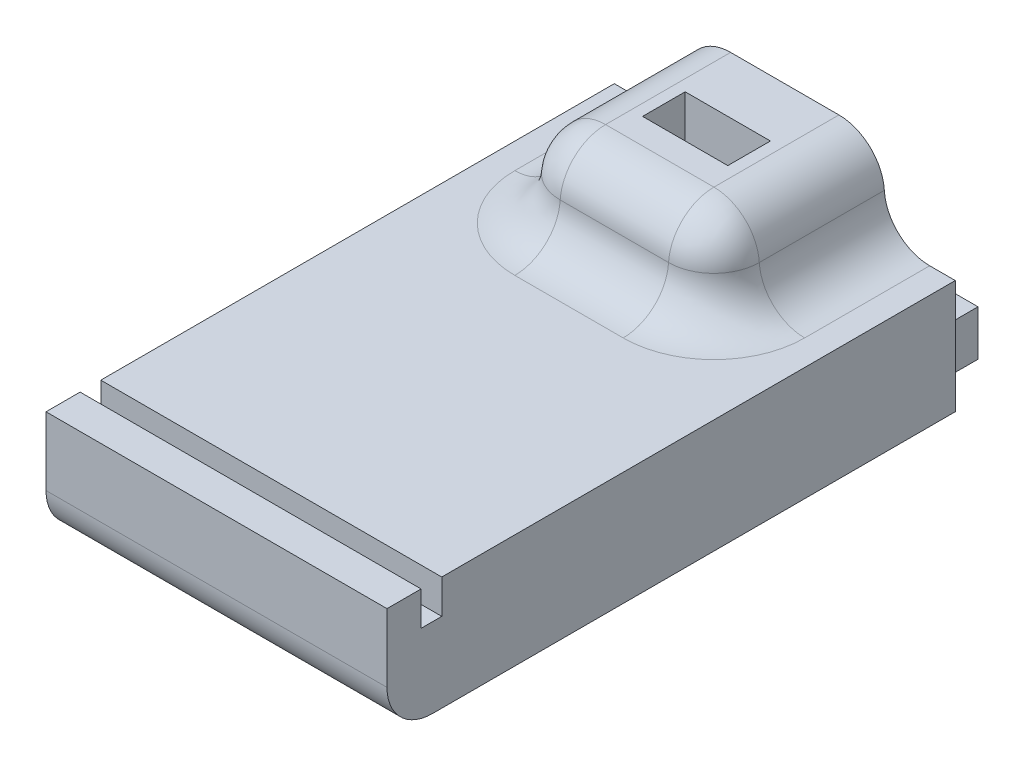
ISO-10303-21;
HEADER;
FILE_DESCRIPTION(('STEP AP214'),'2;1');
FILE_NAME('part.step','',(''),(''),'','','');
FILE_SCHEMA(('AUTOMOTIVE_DESIGN { 1 0 10303 214 1 1 1 1 }'));
ENDSEC;
DATA;
#1=APPLICATION_CONTEXT('core data for automotive mechanical design processes');
#2=APPLICATION_PROTOCOL_DEFINITION('international standard','automotive_design',2000,#1);
#3=PRODUCT_CONTEXT('',#1,'mechanical');
#4=PRODUCT('Part','Part','',(#3));
#5=PRODUCT_RELATED_PRODUCT_CATEGORY('part','',(#4));
#6=PRODUCT_DEFINITION_FORMATION('','',#4);
#7=PRODUCT_DEFINITION_CONTEXT('part definition',#1,'design');
#8=PRODUCT_DEFINITION('design','',#6,#7);
#9=PRODUCT_DEFINITION_SHAPE('','',#8);
#10=(LENGTH_UNIT() NAMED_UNIT(*) SI_UNIT(.MILLI.,.METRE.));
#11=(NAMED_UNIT(*) PLANE_ANGLE_UNIT() SI_UNIT($,.RADIAN.));
#12=(NAMED_UNIT(*) SI_UNIT($,.STERADIAN.) SOLID_ANGLE_UNIT());
#13=UNCERTAINTY_MEASURE_WITH_UNIT(LENGTH_MEASURE(1.E-05),#10,'distance_accuracy_value','');
#14=(GEOMETRIC_REPRESENTATION_CONTEXT(3) GLOBAL_UNCERTAINTY_ASSIGNED_CONTEXT((#13)) GLOBAL_UNIT_ASSIGNED_CONTEXT((#10,
#11,#12)) REPRESENTATION_CONTEXT('',''));
#15=CARTESIAN_POINT('',(0.,0.,0.));
#16=DIRECTION('',(0.,0.,1.));
#17=DIRECTION('',(1.,0.,0.));
#18=AXIS2_PLACEMENT_3D('',#15,#16,#17);
#19=CARTESIAN_POINT('',(0.,10.,0.));
#20=DIRECTION('',(0.,1.,0.));
#21=DIRECTION('',(0.,0.,1.));
#22=AXIS2_PLACEMENT_3D('',#19,#20,#21);
#23=PLANE('',#22);
#24=DIRECTION('',(-1.,0.,0.));
#25=VECTOR('',#24,1.);
#26=CARTESIAN_POINT('',(-15.,10.,20.18));
#27=LINE('',#26,#25);
#28=CARTESIAN_POINT('',(15.,10.,20.18));
#29=VERTEX_POINT('',#28);
#30=CARTESIAN_POINT('',(-15.,10.,20.18));
#31=VERTEX_POINT('',#30);
#32=EDGE_CURVE('E259',#29,#31,#27,.T.);
#33=ORIENTED_EDGE('',*,*,#32,.F.);
#34=DIRECTION('',(0.,0.,-1.));
#35=VECTOR('',#34,1.);
#36=CARTESIAN_POINT('',(15.,10.,-25.));
#37=LINE('',#36,#35);
#38=CARTESIAN_POINT('',(15.,10.,-25.));
#39=VERTEX_POINT('',#38);
#40=EDGE_CURVE('E431',#29,#39,#37,.T.);
#41=ORIENTED_EDGE('',*,*,#40,.T.);
#42=DIRECTION('',(-1.,0.,0.));
#43=VECTOR('',#42,1.);
#44=CARTESIAN_POINT('',(-15.,10.,-25.));
#45=LINE('',#44,#43);
#46=CARTESIAN_POINT('',(12.75,10.,-25.));
#47=VERTEX_POINT('',#46);
#48=EDGE_CURVE('E432',#39,#47,#45,.T.);
#49=ORIENTED_EDGE('',*,*,#48,.T.);
#50=DIRECTION('',(0.,0.,-1.));
#51=VECTOR('',#50,1.);
#52=CARTESIAN_POINT('',(12.75,10.,-10.));
#53=LINE('',#52,#51);
#54=CARTESIAN_POINT('',(12.75,10.,-14.));
#55=VERTEX_POINT('',#54);
#56=EDGE_CURVE('E481',#47,#55,#53,.F.);
#57=ORIENTED_EDGE('',*,*,#56,.T.);
#58=CARTESIAN_POINT('',(4.76564028866434,10.,-14.));
#59=DIRECTION('',(0.,1.,0.));
#60=DIRECTION('',(0.,0.,1.));
#61=AXIS2_PLACEMENT_3D('',#58,#59,#60);
#62=CIRCLE('',#61,7.98435971133566);
#63=CARTESIAN_POINT('',(4.76564028866434,10.,-6.01564028866435));
#64=VERTEX_POINT('',#63);
#65=EDGE_CURVE('E535',#55,#64,#62,.F.);
#66=ORIENTED_EDGE('',*,*,#65,.T.);
#67=DIRECTION('',(-1.,0.,0.));
#68=VECTOR('',#67,1.);
#69=CARTESIAN_POINT('',(-5.82179676972449,10.,-6.01564028866435));
#70=LINE('',#69,#68);
#71=CARTESIAN_POINT('',(-4.76564028866434,10.,-6.01564028866435));
#72=VERTEX_POINT('',#71);
#73=EDGE_CURVE('E524',#64,#72,#70,.T.);
#74=ORIENTED_EDGE('',*,*,#73,.T.);
#75=CARTESIAN_POINT('',(-4.76564028866434,10.,-14.));
#76=DIRECTION('',(0.,1.,0.));
#77=DIRECTION('',(0.,0.,1.));
#78=AXIS2_PLACEMENT_3D('',#75,#76,#77);
#79=CIRCLE('',#78,7.98435971133566);
#80=CARTESIAN_POINT('',(-12.75,10.,-14.));
#81=VERTEX_POINT('',#80);
#82=EDGE_CURVE('E538',#72,#81,#79,.F.);
#83=ORIENTED_EDGE('',*,*,#82,.T.);
#84=DIRECTION('',(0.,0.,1.));
#85=VECTOR('',#84,1.);
#86=CARTESIAN_POINT('',(-12.75,10.,-25.));
#87=LINE('',#86,#85);
#88=CARTESIAN_POINT('',(-12.75,10.,-25.));
#89=VERTEX_POINT('',#88);
#90=EDGE_CURVE('E478',#81,#89,#87,.F.);
#91=ORIENTED_EDGE('',*,*,#90,.T.);
#92=CARTESIAN_POINT('',(-15.,10.,-25.));
#93=VERTEX_POINT('',#92);
#94=EDGE_CURVE('E430',#89,#93,#45,.T.);
#95=ORIENTED_EDGE('',*,*,#94,.T.);
#96=DIRECTION('',(0.,0.,1.));
#97=VECTOR('',#96,1.);
#98=CARTESIAN_POINT('',(-15.,10.,-25.));
#99=LINE('',#98,#97);
#100=EDGE_CURVE('E436',#93,#31,#99,.T.);
#101=ORIENTED_EDGE('',*,*,#100,.T.);
#102=EDGE_LOOP('',(#33,#41,#49,#57,#66,#74,#83,#91,#95,#101));
#103=FACE_BOUND('',#102,.T.);
#104=ADVANCED_FACE('F41',(#103),#23,.T.);
#105=CARTESIAN_POINT('',(8.75,17.5,-10.));
#106=DIRECTION('',(0.,1.,0.));
#107=DIRECTION('',(0.,0.,1.));
#108=AXIS2_PLACEMENT_3D('',#105,#106,#107);
#109=PLANE('',#108);
#110=DIRECTION('',(1.,0.,0.));
#111=VECTOR('',#110,1.);
#112=CARTESIAN_POINT('',(8.75,17.5,-14.));
#113=LINE('',#112,#111);
#114=CARTESIAN_POINT('',(-4.76564028866434,17.5,-14.));
#115=VERTEX_POINT('',#114);
#116=CARTESIAN_POINT('',(4.76564028866434,17.5,-14.));
#117=VERTEX_POINT('',#116);
#118=EDGE_CURVE('E468',#115,#117,#113,.T.);
#119=ORIENTED_EDGE('',*,*,#118,.T.);
#120=DIRECTION('',(0.,0.,-1.));
#121=VECTOR('',#120,1.);
#122=CARTESIAN_POINT('',(4.76564028866434,17.5,-25.));
#123=LINE('',#122,#121);
#124=CARTESIAN_POINT('',(4.76564028866434,17.5,-25.));
#125=VERTEX_POINT('',#124);
#126=EDGE_CURVE('E515',#117,#125,#123,.T.);
#127=ORIENTED_EDGE('',*,*,#126,.T.);
#128=DIRECTION('',(1.,0.,0.));
#129=VECTOR('',#128,1.);
#130=CARTESIAN_POINT('',(8.75,17.5,-25.));
#131=LINE('',#130,#129);
#132=CARTESIAN_POINT('',(-4.76564028866434,17.5,-25.));
#133=VERTEX_POINT('',#132);
#134=EDGE_CURVE('E336',#133,#125,#131,.T.);
#135=ORIENTED_EDGE('',*,*,#134,.F.);
#136=DIRECTION('',(0.,0.,1.));
#137=VECTOR('',#136,1.);
#138=CARTESIAN_POINT('',(-4.76564028866434,17.5,-14.));
#139=LINE('',#138,#137);
#140=EDGE_CURVE('E512',#133,#115,#139,.T.);
#141=ORIENTED_EDGE('',*,*,#140,.T.);
#142=EDGE_LOOP('',(#119,#127,#135,#141));
#143=FACE_BOUND('',#142,.T.);
#144=DIRECTION('',(0.,0.,-1.));
#145=VECTOR('',#144,1.);
#146=CARTESIAN_POINT('',(3.73708770393565,17.5,-16.25));
#147=LINE('',#146,#145);
#148=CARTESIAN_POINT('',(3.73708770393565,17.5,-16.25));
#149=VERTEX_POINT('',#148);
#150=CARTESIAN_POINT('',(3.73708770393565,17.5,-20.));
#151=VERTEX_POINT('',#150);
#152=EDGE_CURVE('E319',#149,#151,#147,.T.);
#153=ORIENTED_EDGE('',*,*,#152,.F.);
#154=DIRECTION('',(1.,0.,0.));
#155=VECTOR('',#154,1.);
#156=CARTESIAN_POINT('',(3.73708770393565,17.5,-16.25));
#157=LINE('',#156,#155);
#158=CARTESIAN_POINT('',(-3.76292046746812,17.5,-16.25));
#159=VERTEX_POINT('',#158);
#160=EDGE_CURVE('E287',#159,#149,#157,.T.);
#161=ORIENTED_EDGE('',*,*,#160,.F.);
#162=DIRECTION('',(0.,0.,-1.));
#163=VECTOR('',#162,1.);
#164=CARTESIAN_POINT('',(-3.76292046746812,17.5,-16.25));
#165=LINE('',#164,#163);
#166=CARTESIAN_POINT('',(-3.76292046746812,17.5,-20.));
#167=VERTEX_POINT('',#166);
#168=EDGE_CURVE('E323',#159,#167,#165,.T.);
#169=ORIENTED_EDGE('',*,*,#168,.T.);
#170=DIRECTION('',(1.,0.,0.));
#171=VECTOR('',#170,1.);
#172=CARTESIAN_POINT('',(3.73708770393565,17.5,-20.));
#173=LINE('',#172,#171);
#174=EDGE_CURVE('E308',#167,#151,#173,.T.);
#175=ORIENTED_EDGE('',*,*,#174,.T.);
#176=EDGE_LOOP('',(#153,#161,#169,#175));
#177=FACE_BOUND('',#176,.T.);
#178=ADVANCED_FACE('F634',(#143,#177),#109,.T.);
#179=CARTESIAN_POINT('',(-15.,10.,-25.));
#180=DIRECTION('',(0.,0.,1.));
#181=DIRECTION('',(1.,0.,0.));
#182=AXIS2_PLACEMENT_3D('',#179,#180,#181);
#183=PLANE('',#182);
#184=CARTESIAN_POINT('',(0.,8.75,-25.));
#185=DIRECTION('',(0.,0.,-1.));
#186=DIRECTION('',(-1.,0.,0.));
#187=AXIS2_PLACEMENT_3D('',#184,#185,#186);
#188=CIRCLE('',#187,2.5);
#189=CARTESIAN_POINT('',(-2.5,8.75,-25.));
#190=VERTEX_POINT('',#189);
#191=EDGE_CURVE('E337',#190,#190,#188,.T.);
#192=ORIENTED_EDGE('',*,*,#191,.F.);
#193=EDGE_LOOP('',(#192));
#194=FACE_BOUND('',#193,.T.);
#195=ORIENTED_EDGE('',*,*,#134,.T.);
#196=CARTESIAN_POINT('',(4.76564028866434,13.5,-25.));
#197=DIRECTION('',(0.,0.,1.));
#198=DIRECTION('',(1.,0.,0.));
#199=AXIS2_PLACEMENT_3D('',#196,#197,#198);
#200=CIRCLE('',#199,4.);
#201=CARTESIAN_POINT('',(8.75782014433217,13.75,-25.));
#202=VERTEX_POINT('',#201);
#203=EDGE_CURVE('E521',#125,#202,#200,.F.);
#204=ORIENTED_EDGE('',*,*,#203,.T.);
#205=CARTESIAN_POINT('',(12.75,14.,-25.));
#206=DIRECTION('',(0.,0.,1.));
#207=DIRECTION('',(1.,0.,0.));
#208=AXIS2_PLACEMENT_3D('',#205,#206,#207);
#209=CIRCLE('',#208,4.);
#210=EDGE_CURVE('E485',#202,#47,#209,.T.);
#211=ORIENTED_EDGE('',*,*,#210,.T.);
#212=ORIENTED_EDGE('',*,*,#48,.F.);
#213=DIRECTION('',(0.,-1.,0.));
#214=VECTOR('',#213,1.);
#215=CARTESIAN_POINT('',(15.,10.,-25.));
#216=LINE('',#215,#214);
#217=CARTESIAN_POINT('',(15.,0.,-25.));
#218=VERTEX_POINT('',#217);
#219=EDGE_CURVE('E464',#39,#218,#216,.T.);
#220=ORIENTED_EDGE('',*,*,#219,.T.);
#221=DIRECTION('',(-1.,0.,0.));
#222=VECTOR('',#221,1.);
#223=CARTESIAN_POINT('',(-15.,0.,-25.));
#224=LINE('',#223,#222);
#225=CARTESIAN_POINT('',(12.,0.,-25.));
#226=VERTEX_POINT('',#225);
#227=EDGE_CURVE('E447',#218,#226,#224,.T.);
#228=ORIENTED_EDGE('',*,*,#227,.T.);
#229=DIRECTION('',(0.,-1.,0.));
#230=VECTOR('',#229,1.);
#231=CARTESIAN_POINT('',(12.,0.,-25.));
#232=LINE('',#231,#230);
#233=CARTESIAN_POINT('',(12.,4.,-25.));
#234=VERTEX_POINT('',#233);
#235=EDGE_CURVE('E385',#234,#226,#232,.T.);
#236=ORIENTED_EDGE('',*,*,#235,.F.);
#237=DIRECTION('',(1.,0.,0.));
#238=VECTOR('',#237,1.);
#239=CARTESIAN_POINT('',(12.,4.,-25.));
#240=LINE('',#239,#238);
#241=CARTESIAN_POINT('',(8.,4.,-25.));
#242=VERTEX_POINT('',#241);
#243=EDGE_CURVE('E391',#242,#234,#240,.T.);
#244=ORIENTED_EDGE('',*,*,#243,.F.);
#245=DIRECTION('',(0.,1.,0.));
#246=VECTOR('',#245,1.);
#247=CARTESIAN_POINT('',(8.,0.,-25.));
#248=LINE('',#247,#246);
#249=CARTESIAN_POINT('',(8.,0.,-25.));
#250=VERTEX_POINT('',#249);
#251=EDGE_CURVE('E404',#250,#242,#248,.T.);
#252=ORIENTED_EDGE('',*,*,#251,.F.);
#253=CARTESIAN_POINT('',(-8.,0.,-25.));
#254=VERTEX_POINT('',#253);
#255=EDGE_CURVE('E451',#250,#254,#224,.T.);
#256=ORIENTED_EDGE('',*,*,#255,.T.);
#257=DIRECTION('',(0.,-1.,0.));
#258=VECTOR('',#257,1.);
#259=CARTESIAN_POINT('',(-8.,0.,-25.));
#260=LINE('',#259,#258);
#261=CARTESIAN_POINT('',(-8.,4.,-25.));
#262=VERTEX_POINT('',#261);
#263=EDGE_CURVE('E345',#262,#254,#260,.T.);
#264=ORIENTED_EDGE('',*,*,#263,.F.);
#265=DIRECTION('',(1.,0.,0.));
#266=VECTOR('',#265,1.);
#267=CARTESIAN_POINT('',(-8.,4.,-25.));
#268=LINE('',#267,#266);
#269=CARTESIAN_POINT('',(-12.,4.,-25.));
#270=VERTEX_POINT('',#269);
#271=EDGE_CURVE('E351',#270,#262,#268,.T.);
#272=ORIENTED_EDGE('',*,*,#271,.F.);
#273=DIRECTION('',(0.,1.,0.));
#274=VECTOR('',#273,1.);
#275=CARTESIAN_POINT('',(-12.,0.,-25.));
#276=LINE('',#275,#274);
#277=CARTESIAN_POINT('',(-12.,0.,-25.));
#278=VERTEX_POINT('',#277);
#279=EDGE_CURVE('E364',#278,#270,#276,.T.);
#280=ORIENTED_EDGE('',*,*,#279,.F.);
#281=CARTESIAN_POINT('',(-15.,0.,-25.));
#282=VERTEX_POINT('',#281);
#283=EDGE_CURVE('E446',#278,#282,#224,.T.);
#284=ORIENTED_EDGE('',*,*,#283,.T.);
#285=DIRECTION('',(0.,-1.,0.));
#286=VECTOR('',#285,1.);
#287=CARTESIAN_POINT('',(-15.,10.,-25.));
#288=LINE('',#287,#286);
#289=EDGE_CURVE('E460',#93,#282,#288,.T.);
#290=ORIENTED_EDGE('',*,*,#289,.F.);
#291=ORIENTED_EDGE('',*,*,#94,.F.);
#292=CARTESIAN_POINT('',(-12.75,14.,-25.));
#293=DIRECTION('',(0.,0.,1.));
#294=DIRECTION('',(1.,0.,0.));
#295=AXIS2_PLACEMENT_3D('',#292,#293,#294);
#296=CIRCLE('',#295,4.);
#297=CARTESIAN_POINT('',(-8.75782014433217,13.75,-25.));
#298=VERTEX_POINT('',#297);
#299=EDGE_CURVE('E488',#89,#298,#296,.T.);
#300=ORIENTED_EDGE('',*,*,#299,.T.);
#301=CARTESIAN_POINT('',(-4.76564028866434,13.5,-25.));
#302=DIRECTION('',(0.,0.,1.));
#303=DIRECTION('',(1.,0.,0.));
#304=AXIS2_PLACEMENT_3D('',#301,#302,#303);
#305=CIRCLE('',#304,4.);
#306=EDGE_CURVE('E518',#298,#133,#305,.F.);
#307=ORIENTED_EDGE('',*,*,#306,.T.);
#308=EDGE_LOOP('',(#195,#204,#211,#212,#220,#228,#236,#244,#252,#256,#264,#272,#280,#284,#290,
#291,#300,#307));
#309=FACE_BOUND('',#308,.T.);
#310=ADVANCED_FACE('F591',(#194,#309),#183,.F.);
#311=CARTESIAN_POINT('',(15.,10.,-25.));
#312=DIRECTION('',(-1.,0.,0.));
#313=DIRECTION('',(0.,0.,1.));
#314=AXIS2_PLACEMENT_3D('',#311,#312,#313);
#315=PLANE('',#314);
#316=DIRECTION('',(0.,-1.,0.));
#317=VECTOR('',#316,1.);
#318=CARTESIAN_POINT('',(15.,10.,25.));
#319=LINE('',#318,#317);
#320=CARTESIAN_POINT('',(15.,10.,25.));
#321=VERTEX_POINT('',#320);
#322=CARTESIAN_POINT('',(15.,4.,25.));
#323=VERTEX_POINT('',#322);
#324=EDGE_CURVE('E443',#321,#323,#319,.T.);
#325=ORIENTED_EDGE('',*,*,#324,.T.);
#326=CARTESIAN_POINT('',(15.,4.,21.));
#327=DIRECTION('',(-1.,0.,0.));
#328=DIRECTION('',(0.,0.,1.));
#329=AXIS2_PLACEMENT_3D('',#326,#327,#328);
#330=CIRCLE('',#329,4.);
#331=CARTESIAN_POINT('',(15.,0.,21.));
#332=VERTEX_POINT('',#331);
#333=EDGE_CURVE('E64',#323,#332,#330,.F.);
#334=ORIENTED_EDGE('',*,*,#333,.T.);
#335=DIRECTION('',(0.,0.,-1.));
#336=VECTOR('',#335,1.);
#337=CARTESIAN_POINT('',(15.,0.,-25.));
#338=LINE('',#337,#336);
#339=EDGE_CURVE('E425',#332,#218,#338,.T.);
#340=ORIENTED_EDGE('',*,*,#339,.T.);
#341=ORIENTED_EDGE('',*,*,#219,.F.);
#342=ORIENTED_EDGE('',*,*,#40,.F.);
#343=DIRECTION('',(0.,1.,0.));
#344=VECTOR('',#343,1.);
#345=CARTESIAN_POINT('',(15.,7.,20.18));
#346=LINE('',#345,#344);
#347=CARTESIAN_POINT('',(15.,7.,20.18));
#348=VERTEX_POINT('',#347);
#349=EDGE_CURVE('E269',#348,#29,#346,.T.);
#350=ORIENTED_EDGE('',*,*,#349,.F.);
#351=DIRECTION('',(0.,0.,-1.));
#352=VECTOR('',#351,1.);
#353=CARTESIAN_POINT('',(15.,7.,22.));
#354=LINE('',#353,#352);
#355=CARTESIAN_POINT('',(15.,7.,22.));
#356=VERTEX_POINT('',#355);
#357=EDGE_CURVE('E248',#356,#348,#354,.T.);
#358=ORIENTED_EDGE('',*,*,#357,.F.);
#359=DIRECTION('',(0.,1.,0.));
#360=VECTOR('',#359,1.);
#361=CARTESIAN_POINT('',(15.,7.,22.));
#362=LINE('',#361,#360);
#363=CARTESIAN_POINT('',(15.,10.,22.));
#364=VERTEX_POINT('',#363);
#365=EDGE_CURVE('E244',#356,#364,#362,.T.);
#366=ORIENTED_EDGE('',*,*,#365,.T.);
#367=EDGE_CURVE('E426',#321,#364,#37,.T.);
#368=ORIENTED_EDGE('',*,*,#367,.F.);
#369=EDGE_LOOP('',(#325,#334,#340,#341,#342,#350,#358,#366,#368));
#370=FACE_BOUND('',#369,.T.);
#371=ADVANCED_FACE('F585',(#370),#315,.F.);
#372=CARTESIAN_POINT('',(-15.,10.,-25.));
#373=DIRECTION('',(1.,0.,0.));
#374=DIRECTION('',(0.,0.,-1.));
#375=AXIS2_PLACEMENT_3D('',#372,#373,#374);
#376=PLANE('',#375);
#377=DIRECTION('',(0.,0.,1.));
#378=VECTOR('',#377,1.);
#379=CARTESIAN_POINT('',(-15.,0.,-25.));
#380=LINE('',#379,#378);
#381=CARTESIAN_POINT('',(-15.,0.,21.));
#382=VERTEX_POINT('',#381);
#383=EDGE_CURVE('E450',#282,#382,#380,.T.);
#384=ORIENTED_EDGE('',*,*,#383,.T.);
#385=CARTESIAN_POINT('',(-15.,4.,21.));
#386=DIRECTION('',(1.,0.,0.));
#387=DIRECTION('',(0.,0.,-1.));
#388=AXIS2_PLACEMENT_3D('',#385,#386,#387);
#389=CIRCLE('',#388,4.);
#390=CARTESIAN_POINT('',(-15.,4.,25.));
#391=VERTEX_POINT('',#390);
#392=EDGE_CURVE('E11',#382,#391,#389,.F.);
#393=ORIENTED_EDGE('',*,*,#392,.T.);
#394=DIRECTION('',(0.,-1.,0.));
#395=VECTOR('',#394,1.);
#396=CARTESIAN_POINT('',(-15.,10.,25.));
#397=LINE('',#396,#395);
#398=CARTESIAN_POINT('',(-15.,10.,25.));
#399=VERTEX_POINT('',#398);
#400=EDGE_CURVE('E456',#399,#391,#397,.T.);
#401=ORIENTED_EDGE('',*,*,#400,.F.);
#402=CARTESIAN_POINT('',(-15.,10.,22.));
#403=VERTEX_POINT('',#402);
#404=EDGE_CURVE('E264',#403,#399,#99,.T.);
#405=ORIENTED_EDGE('',*,*,#404,.F.);
#406=DIRECTION('',(0.,1.,0.));
#407=VECTOR('',#406,1.);
#408=CARTESIAN_POINT('',(-15.,7.,22.));
#409=LINE('',#408,#407);
#410=CARTESIAN_POINT('',(-15.,7.,22.));
#411=VERTEX_POINT('',#410);
#412=EDGE_CURVE('E241',#411,#403,#409,.T.);
#413=ORIENTED_EDGE('',*,*,#412,.F.);
#414=DIRECTION('',(0.,0.,1.));
#415=VECTOR('',#414,1.);
#416=CARTESIAN_POINT('',(-15.,7.,22.));
#417=LINE('',#416,#415);
#418=CARTESIAN_POINT('',(-15.,7.,20.18));
#419=VERTEX_POINT('',#418);
#420=EDGE_CURVE('E249',#419,#411,#417,.T.);
#421=ORIENTED_EDGE('',*,*,#420,.F.);
#422=DIRECTION('',(0.,1.,0.));
#423=VECTOR('',#422,1.);
#424=CARTESIAN_POINT('',(-15.,7.,20.18));
#425=LINE('',#424,#423);
#426=EDGE_CURVE('E556',#419,#31,#425,.T.);
#427=ORIENTED_EDGE('',*,*,#426,.T.);
#428=ORIENTED_EDGE('',*,*,#100,.F.);
#429=ORIENTED_EDGE('',*,*,#289,.T.);
#430=EDGE_LOOP('',(#384,#393,#401,#405,#413,#421,#427,#428,#429));
#431=FACE_BOUND('',#430,.T.);
#432=ADVANCED_FACE('F262',(#431),#376,.F.);
#433=CARTESIAN_POINT('',(-15.,10.,25.));
#434=DIRECTION('',(0.,0.,-1.));
#435=DIRECTION('',(-1.,0.,0.));
#436=AXIS2_PLACEMENT_3D('',#433,#434,#435);
#437=PLANE('',#436);
#438=ORIENTED_EDGE('',*,*,#400,.T.);
#439=DIRECTION('',(1.,0.,0.));
#440=VECTOR('',#439,1.);
#441=CARTESIAN_POINT('',(-15.,4.,25.));
#442=LINE('',#441,#440);
#443=EDGE_CURVE('E551',#391,#323,#442,.T.);
#444=ORIENTED_EDGE('',*,*,#443,.T.);
#445=ORIENTED_EDGE('',*,*,#324,.F.);
#446=DIRECTION('',(1.,0.,0.));
#447=VECTOR('',#446,1.);
#448=CARTESIAN_POINT('',(-15.,10.,25.));
#449=LINE('',#448,#447);
#450=EDGE_CURVE('E440',#399,#321,#449,.T.);
#451=ORIENTED_EDGE('',*,*,#450,.F.);
#452=EDGE_LOOP('',(#438,#444,#445,#451));
#453=FACE_BOUND('',#452,.T.);
#454=ADVANCED_FACE('F660',(#453),#437,.F.);
#455=DIRECTION('',(1.,0.,0.));
#456=VECTOR('',#455,1.);
#457=CARTESIAN_POINT('',(-15.,10.,22.));
#458=LINE('',#457,#456);
#459=EDGE_CURVE('E579',#403,#364,#458,.T.);
#460=ORIENTED_EDGE('',*,*,#459,.F.);
#461=ORIENTED_EDGE('',*,*,#404,.T.);
#462=ORIENTED_EDGE('',*,*,#450,.T.);
#463=ORIENTED_EDGE('',*,*,#367,.T.);
#464=EDGE_LOOP('',(#460,#461,#462,#463));
#465=FACE_BOUND('',#464,.T.);
#466=ADVANCED_FACE('F651',(#465),#23,.T.);
#467=CARTESIAN_POINT('',(0.,0.,0.));
#468=DIRECTION('',(0.,1.,0.));
#469=DIRECTION('',(0.,0.,1.));
#470=AXIS2_PLACEMENT_3D('',#467,#468,#469);
#471=PLANE('',#470);
#472=ORIENTED_EDGE('',*,*,#339,.F.);
#473=DIRECTION('',(1.,0.,0.));
#474=VECTOR('',#473,1.);
#475=CARTESIAN_POINT('',(0.,0.,21.));
#476=LINE('',#475,#474);
#477=EDGE_CURVE('E50',#332,#382,#476,.F.);
#478=ORIENTED_EDGE('',*,*,#477,.T.);
#479=ORIENTED_EDGE('',*,*,#383,.F.);
#480=ORIENTED_EDGE('',*,*,#283,.F.);
#481=DIRECTION('',(0.,0.,1.));
#482=VECTOR('',#481,1.);
#483=CARTESIAN_POINT('',(-12.,0.,-30.));
#484=LINE('',#483,#482);
#485=CARTESIAN_POINT('',(-12.,0.,-30.));
#486=VERTEX_POINT('',#485);
#487=EDGE_CURVE('E377',#486,#278,#484,.T.);
#488=ORIENTED_EDGE('',*,*,#487,.F.);
#489=DIRECTION('',(-1.,0.,0.));
#490=VECTOR('',#489,1.);
#491=CARTESIAN_POINT('',(-8.,0.,-30.));
#492=LINE('',#491,#490);
#493=CARTESIAN_POINT('',(-8.,0.,-30.));
#494=VERTEX_POINT('',#493);
#495=EDGE_CURVE('E350',#494,#486,#492,.T.);
#496=ORIENTED_EDGE('',*,*,#495,.F.);
#497=DIRECTION('',(0.,0.,1.));
#498=VECTOR('',#497,1.);
#499=CARTESIAN_POINT('',(-8.,0.,-30.));
#500=LINE('',#499,#498);
#501=EDGE_CURVE('E381',#494,#254,#500,.T.);
#502=ORIENTED_EDGE('',*,*,#501,.T.);
#503=ORIENTED_EDGE('',*,*,#255,.F.);
#504=DIRECTION('',(0.,0.,1.));
#505=VECTOR('',#504,1.);
#506=CARTESIAN_POINT('',(8.,0.,-30.));
#507=LINE('',#506,#505);
#508=CARTESIAN_POINT('',(8.,0.,-30.));
#509=VERTEX_POINT('',#508);
#510=EDGE_CURVE('E417',#509,#250,#507,.T.);
#511=ORIENTED_EDGE('',*,*,#510,.F.);
#512=DIRECTION('',(-1.,0.,0.));
#513=VECTOR('',#512,1.);
#514=CARTESIAN_POINT('',(12.,0.,-30.));
#515=LINE('',#514,#513);
#516=CARTESIAN_POINT('',(12.,0.,-30.));
#517=VERTEX_POINT('',#516);
#518=EDGE_CURVE('E390',#517,#509,#515,.T.);
#519=ORIENTED_EDGE('',*,*,#518,.F.);
#520=DIRECTION('',(0.,0.,1.));
#521=VECTOR('',#520,1.);
#522=CARTESIAN_POINT('',(12.,0.,-30.));
#523=LINE('',#522,#521);
#524=EDGE_CURVE('E421',#517,#226,#523,.T.);
#525=ORIENTED_EDGE('',*,*,#524,.T.);
#526=ORIENTED_EDGE('',*,*,#227,.F.);
#527=EDGE_LOOP('',(#472,#478,#479,#480,#488,#496,#502,#503,#511,#519,#525,#526));
#528=FACE_BOUND('',#527,.T.);
#529=ADVANCED_FACE('F659',(#528),#471,.F.);
#530=CARTESIAN_POINT('',(12.,0.,-30.));
#531=DIRECTION('',(-1.,0.,0.));
#532=DIRECTION('',(0.,0.,1.));
#533=AXIS2_PLACEMENT_3D('',#530,#531,#532);
#534=PLANE('',#533);
#535=ORIENTED_EDGE('',*,*,#235,.T.);
#536=ORIENTED_EDGE('',*,*,#524,.F.);
#537=DIRECTION('',(0.,-1.,0.));
#538=VECTOR('',#537,1.);
#539=CARTESIAN_POINT('',(12.,0.,-30.));
#540=LINE('',#539,#538);
#541=CARTESIAN_POINT('',(12.,4.,-30.));
#542=VERTEX_POINT('',#541);
#543=EDGE_CURVE('E386',#542,#517,#540,.T.);
#544=ORIENTED_EDGE('',*,*,#543,.F.);
#545=DIRECTION('',(0.,0.,1.));
#546=VECTOR('',#545,1.);
#547=CARTESIAN_POINT('',(12.,4.,-30.));
#548=LINE('',#547,#546);
#549=EDGE_CURVE('E400',#542,#234,#548,.T.);
#550=ORIENTED_EDGE('',*,*,#549,.T.);
#551=EDGE_LOOP('',(#535,#536,#544,#550));
#552=FACE_BOUND('',#551,.T.);
#553=ADVANCED_FACE('F666',(#552),#534,.F.);
#554=CARTESIAN_POINT('',(8.,0.,-30.));
#555=DIRECTION('',(1.,0.,0.));
#556=DIRECTION('',(0.,0.,-1.));
#557=AXIS2_PLACEMENT_3D('',#554,#555,#556);
#558=PLANE('',#557);
#559=ORIENTED_EDGE('',*,*,#251,.T.);
#560=DIRECTION('',(0.,0.,1.));
#561=VECTOR('',#560,1.);
#562=CARTESIAN_POINT('',(8.,4.,-30.));
#563=LINE('',#562,#561);
#564=CARTESIAN_POINT('',(8.,4.,-30.));
#565=VERTEX_POINT('',#564);
#566=EDGE_CURVE('E413',#565,#242,#563,.T.);
#567=ORIENTED_EDGE('',*,*,#566,.F.);
#568=DIRECTION('',(0.,1.,0.));
#569=VECTOR('',#568,1.);
#570=CARTESIAN_POINT('',(8.,0.,-30.));
#571=LINE('',#570,#569);
#572=EDGE_CURVE('E394',#509,#565,#571,.T.);
#573=ORIENTED_EDGE('',*,*,#572,.F.);
#574=ORIENTED_EDGE('',*,*,#510,.T.);
#575=EDGE_LOOP('',(#559,#567,#573,#574));
#576=FACE_BOUND('',#575,.T.);
#577=ADVANCED_FACE('F696',(#576),#558,.F.);
#578=CARTESIAN_POINT('',(12.,4.,-30.));
#579=DIRECTION('',(0.,-1.,0.));
#580=DIRECTION('',(0.,0.,-1.));
#581=AXIS2_PLACEMENT_3D('',#578,#579,#580);
#582=PLANE('',#581);
#583=ORIENTED_EDGE('',*,*,#243,.T.);
#584=ORIENTED_EDGE('',*,*,#549,.F.);
#585=DIRECTION('',(1.,0.,0.));
#586=VECTOR('',#585,1.);
#587=CARTESIAN_POINT('',(12.,4.,-30.));
#588=LINE('',#587,#586);
#589=EDGE_CURVE('E397',#565,#542,#588,.T.);
#590=ORIENTED_EDGE('',*,*,#589,.F.);
#591=ORIENTED_EDGE('',*,*,#566,.T.);
#592=EDGE_LOOP('',(#583,#584,#590,#591));
#593=FACE_BOUND('',#592,.T.);
#594=ADVANCED_FACE('F700',(#593),#582,.F.);
#595=CARTESIAN_POINT('',(0.,0.,-30.));
#596=DIRECTION('',(0.,0.,1.));
#597=DIRECTION('',(1.,0.,0.));
#598=AXIS2_PLACEMENT_3D('',#595,#596,#597);
#599=PLANE('',#598);
#600=ORIENTED_EDGE('',*,*,#543,.T.);
#601=ORIENTED_EDGE('',*,*,#518,.T.);
#602=ORIENTED_EDGE('',*,*,#572,.T.);
#603=ORIENTED_EDGE('',*,*,#589,.T.);
#604=EDGE_LOOP('',(#600,#601,#602,#603));
#605=FACE_BOUND('',#604,.T.);
#606=ADVANCED_FACE('F704',(#605),#599,.F.);
#607=CARTESIAN_POINT('',(-8.,0.,-30.));
#608=DIRECTION('',(-1.,0.,0.));
#609=DIRECTION('',(0.,0.,1.));
#610=AXIS2_PLACEMENT_3D('',#607,#608,#609);
#611=PLANE('',#610);
#612=ORIENTED_EDGE('',*,*,#263,.T.);
#613=ORIENTED_EDGE('',*,*,#501,.F.);
#614=DIRECTION('',(0.,-1.,0.));
#615=VECTOR('',#614,1.);
#616=CARTESIAN_POINT('',(-8.,0.,-30.));
#617=LINE('',#616,#615);
#618=CARTESIAN_POINT('',(-8.,4.,-30.));
#619=VERTEX_POINT('',#618);
#620=EDGE_CURVE('E346',#619,#494,#617,.T.);
#621=ORIENTED_EDGE('',*,*,#620,.F.);
#622=DIRECTION('',(0.,0.,1.));
#623=VECTOR('',#622,1.);
#624=CARTESIAN_POINT('',(-8.,4.,-30.));
#625=LINE('',#624,#623);
#626=EDGE_CURVE('E360',#619,#262,#625,.T.);
#627=ORIENTED_EDGE('',*,*,#626,.T.);
#628=EDGE_LOOP('',(#612,#613,#621,#627));
#629=FACE_BOUND('',#628,.T.);
#630=ADVANCED_FACE('F692',(#629),#611,.F.);
#631=CARTESIAN_POINT('',(-12.,0.,-30.));
#632=DIRECTION('',(1.,0.,0.));
#633=DIRECTION('',(0.,0.,-1.));
#634=AXIS2_PLACEMENT_3D('',#631,#632,#633);
#635=PLANE('',#634);
#636=ORIENTED_EDGE('',*,*,#279,.T.);
#637=DIRECTION('',(0.,0.,1.));
#638=VECTOR('',#637,1.);
#639=CARTESIAN_POINT('',(-12.,4.,-30.));
#640=LINE('',#639,#638);
#641=CARTESIAN_POINT('',(-12.,4.,-30.));
#642=VERTEX_POINT('',#641);
#643=EDGE_CURVE('E373',#642,#270,#640,.T.);
#644=ORIENTED_EDGE('',*,*,#643,.F.);
#645=DIRECTION('',(0.,1.,0.));
#646=VECTOR('',#645,1.);
#647=CARTESIAN_POINT('',(-12.,0.,-30.));
#648=LINE('',#647,#646);
#649=EDGE_CURVE('E354',#486,#642,#648,.T.);
#650=ORIENTED_EDGE('',*,*,#649,.F.);
#651=ORIENTED_EDGE('',*,*,#487,.T.);
#652=EDGE_LOOP('',(#636,#644,#650,#651));
#653=FACE_BOUND('',#652,.T.);
#654=ADVANCED_FACE('F682',(#653),#635,.F.);
#655=CARTESIAN_POINT('',(-8.,4.,-30.));
#656=DIRECTION('',(0.,-1.,0.));
#657=DIRECTION('',(0.,0.,-1.));
#658=AXIS2_PLACEMENT_3D('',#655,#656,#657);
#659=PLANE('',#658);
#660=ORIENTED_EDGE('',*,*,#271,.T.);
#661=ORIENTED_EDGE('',*,*,#626,.F.);
#662=DIRECTION('',(1.,0.,0.));
#663=VECTOR('',#662,1.);
#664=CARTESIAN_POINT('',(-8.,4.,-30.));
#665=LINE('',#664,#663);
#666=EDGE_CURVE('E357',#642,#619,#665,.T.);
#667=ORIENTED_EDGE('',*,*,#666,.F.);
#668=ORIENTED_EDGE('',*,*,#643,.T.);
#669=EDGE_LOOP('',(#660,#661,#667,#668));
#670=FACE_BOUND('',#669,.T.);
#671=ADVANCED_FACE('F722',(#670),#659,.F.);
#672=CARTESIAN_POINT('',(0.,0.,-30.));
#673=DIRECTION('',(0.,0.,1.));
#674=DIRECTION('',(1.,0.,0.));
#675=AXIS2_PLACEMENT_3D('',#672,#673,#674);
#676=PLANE('',#675);
#677=ORIENTED_EDGE('',*,*,#620,.T.);
#678=ORIENTED_EDGE('',*,*,#495,.T.);
#679=ORIENTED_EDGE('',*,*,#649,.T.);
#680=ORIENTED_EDGE('',*,*,#666,.T.);
#681=EDGE_LOOP('',(#677,#678,#679,#680));
#682=FACE_BOUND('',#681,.T.);
#683=ADVANCED_FACE('F685',(#682),#676,.F.);
#684=CARTESIAN_POINT('',(0.,8.75,-15.));
#685=DIRECTION('',(0.,0.,-1.));
#686=DIRECTION('',(-1.,0.,0.));
#687=AXIS2_PLACEMENT_3D('',#684,#685,#686);
#688=CYLINDRICAL_SURFACE('',#687,2.5);
#689=CARTESIAN_POINT('',(0.,8.75,-20.));
#690=DIRECTION('',(0.,0.,-1.));
#691=DIRECTION('',(-1.,0.,0.));
#692=AXIS2_PLACEMENT_3D('',#689,#690,#691);
#693=CIRCLE('',#692,2.5);
#694=CARTESIAN_POINT('',(-2.5,8.75,-20.));
#695=VERTEX_POINT('',#694);
#696=EDGE_CURVE('E318',#695,#695,#693,.F.);
#697=ORIENTED_EDGE('',*,*,#696,.T.);
#698=EDGE_LOOP('',(#697));
#699=FACE_BOUND('',#698,.T.);
#700=ORIENTED_EDGE('',*,*,#191,.T.);
#701=EDGE_LOOP('',(#700));
#702=FACE_BOUND('',#701,.T.);
#703=ADVANCED_FACE('F727',(#699,#702),#688,.F.);
#704=CARTESIAN_POINT('',(0.,0.,-16.25));
#705=DIRECTION('',(0.,0.,-1.));
#706=DIRECTION('',(-1.,0.,0.));
#707=AXIS2_PLACEMENT_3D('',#704,#705,#706);
#708=PLANE('',#707);
#709=DIRECTION('',(-0.865286382079132,-0.501277844102854,0.));
#710=VECTOR('',#709,1.);
#711=CARTESIAN_POINT('',(3.75319188645893,6.59047443557181,-16.25));
#712=LINE('',#711,#710);
#713=CARTESIAN_POINT('',(3.75319188645893,6.59047443557181,-16.25));
#714=VERTEX_POINT('',#713);
#715=CARTESIAN_POINT('',(0.00639194431259526,4.41987769883495,-16.25));
#716=VERTEX_POINT('',#715);
#717=EDGE_CURVE('E274',#714,#716,#712,.T.);
#718=ORIENTED_EDGE('',*,*,#717,.T.);
#719=DIRECTION('',(-0.866762538386956,0.49872106637779,0.));
#720=VECTOR('',#719,1.);
#721=CARTESIAN_POINT('',(0.00639194431259526,4.41987769883495,-16.25));
#722=LINE('',#721,#720);
#723=CARTESIAN_POINT('',(-3.7467999421462,6.57940326326302,-16.25));
#724=VERTEX_POINT('',#723);
#725=EDGE_CURVE('E278',#716,#724,#722,.T.);
#726=ORIENTED_EDGE('',*,*,#725,.T.);
#727=DIRECTION('',(-0.00147615630783881,0.999998910480684,0.));
#728=VECTOR('',#727,1.);
#729=CARTESIAN_POINT('',(-3.7467999421462,6.57940326326302,-16.25));
#730=LINE('',#729,#728);
#731=EDGE_CURVE('E283',#724,#159,#730,.T.);
#732=ORIENTED_EDGE('',*,*,#731,.T.);
#733=ORIENTED_EDGE('',*,*,#160,.T.);
#734=DIRECTION('',(0.00147615630783859,-0.999998910480684,0.));
#735=VECTOR('',#734,1.);
#736=CARTESIAN_POINT('',(3.73708770393565,17.5,-16.25));
#737=LINE('',#736,#735);
#738=EDGE_CURVE('E290',#149,#714,#737,.T.);
#739=ORIENTED_EDGE('',*,*,#738,.T.);
#740=EDGE_LOOP('',(#718,#726,#732,#733,#739));
#741=FACE_BOUND('',#740,.T.);
#742=CARTESIAN_POINT('',(0.,8.75,-16.25));
#743=DIRECTION('',(0.,0.,-1.));
#744=DIRECTION('',(-1.,0.,0.));
#745=AXIS2_PLACEMENT_3D('',#742,#743,#744);
#746=CIRCLE('',#745,2.5);
#747=CARTESIAN_POINT('',(-2.5,8.75,-16.25));
#748=VERTEX_POINT('',#747);
#749=EDGE_CURVE('E341',#748,#748,#746,.F.);
#750=ORIENTED_EDGE('',*,*,#749,.T.);
#751=EDGE_LOOP('',(#750));
#752=FACE_BOUND('',#751,.T.);
#753=ADVANCED_FACE('F731',(#741,#752),#708,.T.);
#754=CARTESIAN_POINT('',(0.,0.,-20.));
#755=DIRECTION('',(0.,0.,-1.));
#756=DIRECTION('',(-1.,0.,0.));
#757=AXIS2_PLACEMENT_3D('',#754,#755,#756);
#758=PLANE('',#757);
#759=DIRECTION('',(-0.865286382079132,-0.501277844102854,0.));
#760=VECTOR('',#759,1.);
#761=CARTESIAN_POINT('',(3.75319188645893,6.59047443557181,-20.));
#762=LINE('',#761,#760);
#763=CARTESIAN_POINT('',(3.75319188645893,6.59047443557181,-20.));
#764=VERTEX_POINT('',#763);
#765=CARTESIAN_POINT('',(0.00639194431259526,4.41987769883495,-20.));
#766=VERTEX_POINT('',#765);
#767=EDGE_CURVE('E295',#764,#766,#762,.T.);
#768=ORIENTED_EDGE('',*,*,#767,.F.);
#769=DIRECTION('',(0.00147615630783859,-0.999998910480684,0.));
#770=VECTOR('',#769,1.);
#771=CARTESIAN_POINT('',(3.73708770393565,17.5,-20.));
#772=LINE('',#771,#770);
#773=EDGE_CURVE('E279',#151,#764,#772,.T.);
#774=ORIENTED_EDGE('',*,*,#773,.F.);
#775=ORIENTED_EDGE('',*,*,#174,.F.);
#776=DIRECTION('',(-0.00147615630783881,0.999998910480684,0.));
#777=VECTOR('',#776,1.);
#778=CARTESIAN_POINT('',(-3.7467999421462,6.57940326326302,-20.));
#779=LINE('',#778,#777);
#780=CARTESIAN_POINT('',(-3.7467999421462,6.57940326326302,-20.));
#781=VERTEX_POINT('',#780);
#782=EDGE_CURVE('E304',#781,#167,#779,.T.);
#783=ORIENTED_EDGE('',*,*,#782,.F.);
#784=DIRECTION('',(-0.866762538386956,0.49872106637779,0.));
#785=VECTOR('',#784,1.);
#786=CARTESIAN_POINT('',(0.00639194431259526,4.41987769883495,-20.));
#787=LINE('',#786,#785);
#788=EDGE_CURVE('E299',#766,#781,#787,.T.);
#789=ORIENTED_EDGE('',*,*,#788,.F.);
#790=EDGE_LOOP('',(#768,#774,#775,#783,#789));
#791=FACE_BOUND('',#790,.T.);
#792=ORIENTED_EDGE('',*,*,#696,.F.);
#793=EDGE_LOOP('',(#792));
#794=FACE_BOUND('',#793,.T.);
#795=ADVANCED_FACE('F743',(#791,#794),#758,.F.);
#796=CARTESIAN_POINT('',(3.75319188645893,6.59047443557181,-16.25));
#797=DIRECTION('',(0.501277844102854,-0.865286382079132,0.));
#798=DIRECTION('',(0.865286382079133,0.501277844102854,0.));
#799=AXIS2_PLACEMENT_3D('',#796,#797,#798);
#800=PLANE('',#799);
#801=ORIENTED_EDGE('',*,*,#767,.T.);
#802=DIRECTION('',(0.,0.,-1.));
#803=VECTOR('',#802,1.);
#804=CARTESIAN_POINT('',(0.00639194431259526,4.41987769883495,-16.25));
#805=LINE('',#804,#803);
#806=EDGE_CURVE('E294',#716,#766,#805,.T.);
#807=ORIENTED_EDGE('',*,*,#806,.F.);
#808=ORIENTED_EDGE('',*,*,#717,.F.);
#809=DIRECTION('',(0.,0.,-1.));
#810=VECTOR('',#809,1.);
#811=CARTESIAN_POINT('',(3.75319188645893,6.59047443557181,-16.25));
#812=LINE('',#811,#810);
#813=EDGE_CURVE('E315',#714,#764,#812,.T.);
#814=ORIENTED_EDGE('',*,*,#813,.T.);
#815=EDGE_LOOP('',(#801,#807,#808,#814));
#816=FACE_BOUND('',#815,.T.);
#817=ADVANCED_FACE('F739',(#816),#800,.F.);
#818=CARTESIAN_POINT('',(3.73708770393565,17.5,-16.25));
#819=DIRECTION('',(0.999998910480684,0.00147615630783859,0.));
#820=DIRECTION('',(-0.00147615630783859,0.999998910480684,0.));
#821=AXIS2_PLACEMENT_3D('',#818,#819,#820);
#822=PLANE('',#821);
#823=ORIENTED_EDGE('',*,*,#773,.T.);
#824=ORIENTED_EDGE('',*,*,#813,.F.);
#825=ORIENTED_EDGE('',*,*,#738,.F.);
#826=ORIENTED_EDGE('',*,*,#152,.T.);
#827=EDGE_LOOP('',(#823,#824,#825,#826));
#828=FACE_BOUND('',#827,.T.);
#829=ADVANCED_FACE('F742',(#828),#822,.F.);
#830=CARTESIAN_POINT('',(-3.7467999421462,6.57940326326302,-16.25));
#831=DIRECTION('',(-0.999998910480684,-0.00147615630783881,0.));
#832=DIRECTION('',(0.00147615630783881,-0.999998910480684,0.));
#833=AXIS2_PLACEMENT_3D('',#830,#831,#832);
#834=PLANE('',#833);
#835=ORIENTED_EDGE('',*,*,#782,.T.);
#836=ORIENTED_EDGE('',*,*,#168,.F.);
#837=ORIENTED_EDGE('',*,*,#731,.F.);
#838=DIRECTION('',(0.,0.,-1.));
#839=VECTOR('',#838,1.);
#840=CARTESIAN_POINT('',(-3.7467999421462,6.57940326326302,-16.25));
#841=LINE('',#840,#839);
#842=EDGE_CURVE('E327',#724,#781,#841,.T.);
#843=ORIENTED_EDGE('',*,*,#842,.T.);
#844=EDGE_LOOP('',(#835,#836,#837,#843));
#845=FACE_BOUND('',#844,.T.);
#846=ADVANCED_FACE('F747',(#845),#834,.F.);
#847=CARTESIAN_POINT('',(0.00639194431259526,4.41987769883495,-16.25));
#848=DIRECTION('',(-0.49872106637779,-0.866762538386956,0.));
#849=DIRECTION('',(0.866762538386956,-0.49872106637779,0.));
#850=AXIS2_PLACEMENT_3D('',#847,#848,#849);
#851=PLANE('',#850);
#852=ORIENTED_EDGE('',*,*,#788,.T.);
#853=ORIENTED_EDGE('',*,*,#842,.F.);
#854=ORIENTED_EDGE('',*,*,#725,.F.);
#855=ORIENTED_EDGE('',*,*,#806,.T.);
#856=EDGE_LOOP('',(#852,#853,#854,#855));
#857=FACE_BOUND('',#856,.T.);
#858=ADVANCED_FACE('F737',(#857),#851,.F.);
#859=CARTESIAN_POINT('',(0.,8.75,-15.));
#860=DIRECTION('',(0.,0.,-1.));
#861=DIRECTION('',(-1.,0.,0.));
#862=AXIS2_PLACEMENT_3D('',#859,#860,#861);
#863=PLANE('',#862);
#864=CARTESIAN_POINT('',(0.,8.75,-15.));
#865=DIRECTION('',(0.,0.,-1.));
#866=DIRECTION('',(-1.,0.,0.));
#867=AXIS2_PLACEMENT_3D('',#864,#865,#866);
#868=CIRCLE('',#867,2.5);
#869=CARTESIAN_POINT('',(-2.5,8.75,-15.));
#870=VERTEX_POINT('',#869);
#871=EDGE_CURVE('E332',#870,#870,#868,.T.);
#872=ORIENTED_EDGE('',*,*,#871,.T.);
#873=EDGE_LOOP('',(#872));
#874=FACE_BOUND('',#873,.T.);
#875=ADVANCED_FACE('F734',(#874),#863,.T.);
#876=ORIENTED_EDGE('',*,*,#871,.F.);
#877=EDGE_LOOP('',(#876));
#878=FACE_BOUND('',#877,.T.);
#879=ORIENTED_EDGE('',*,*,#749,.F.);
#880=EDGE_LOOP('',(#879));
#881=FACE_BOUND('',#880,.T.);
#882=ADVANCED_FACE('F733',(#878,#881),#688,.F.);
#883=CARTESIAN_POINT('',(8.75,13.5,-14.));
#884=DIRECTION('',(1.,0.,0.));
#885=DIRECTION('',(0.,0.,-1.));
#886=AXIS2_PLACEMENT_3D('',#883,#884,#885);
#887=CYLINDRICAL_SURFACE('',#886,4.);
#888=CARTESIAN_POINT('',(-4.76564028866434,13.5,-14.));
#889=DIRECTION('',(1.,0.,0.));
#890=DIRECTION('',(0.,0.,-1.));
#891=AXIS2_PLACEMENT_3D('',#888,#889,#890);
#892=CIRCLE('',#891,4.);
#893=CARTESIAN_POINT('',(-4.76564028866434,13.75,-10.0078201443322));
#894=VERTEX_POINT('',#893);
#895=EDGE_CURVE('E499',#115,#894,#892,.T.);
#896=ORIENTED_EDGE('',*,*,#895,.T.);
#897=DIRECTION('',(1.,0.,0.));
#898=VECTOR('',#897,1.);
#899=CARTESIAN_POINT('',(8.75,13.75,-10.0078201443322));
#900=LINE('',#899,#898);
#901=CARTESIAN_POINT('',(4.76564028866434,13.75,-10.0078201443322));
#902=VERTEX_POINT('',#901);
#903=EDGE_CURVE('E548',#894,#902,#900,.T.);
#904=ORIENTED_EDGE('',*,*,#903,.T.);
#905=CARTESIAN_POINT('',(4.76564028866434,13.5,-14.));
#906=DIRECTION('',(1.,0.,0.));
#907=DIRECTION('',(0.,0.,-1.));
#908=AXIS2_PLACEMENT_3D('',#905,#906,#907);
#909=CIRCLE('',#908,4.);
#910=EDGE_CURVE('E503',#902,#117,#909,.F.);
#911=ORIENTED_EDGE('',*,*,#910,.T.);
#912=ORIENTED_EDGE('',*,*,#118,.F.);
#913=EDGE_LOOP('',(#896,#904,#911,#912));
#914=FACE_BOUND('',#913,.T.);
#915=ADVANCED_FACE('F637',(#914),#887,.T.);
#916=CARTESIAN_POINT('',(12.75,14.,-10.));
#917=DIRECTION('',(0.,0.,1.));
#918=DIRECTION('',(1.,0.,0.));
#919=AXIS2_PLACEMENT_3D('',#916,#917,#918);
#920=CYLINDRICAL_SURFACE('',#919,4.);
#921=DIRECTION('',(0.,0.,1.));
#922=VECTOR('',#921,1.);
#923=CARTESIAN_POINT('',(8.75782014433217,13.75,-10.));
#924=LINE('',#923,#922);
#925=CARTESIAN_POINT('',(8.75782014433217,13.75,-14.));
#926=VERTEX_POINT('',#925);
#927=EDGE_CURVE('E492',#202,#926,#924,.T.);
#928=ORIENTED_EDGE('',*,*,#927,.T.);
#929=CARTESIAN_POINT('',(12.75,14.,-14.));
#930=DIRECTION('',(0.,0.,1.));
#931=DIRECTION('',(1.,0.,0.));
#932=AXIS2_PLACEMENT_3D('',#929,#930,#931);
#933=CIRCLE('',#932,4.);
#934=EDGE_CURVE('E496',#926,#55,#933,.T.);
#935=ORIENTED_EDGE('',*,*,#934,.T.);
#936=ORIENTED_EDGE('',*,*,#56,.F.);
#937=ORIENTED_EDGE('',*,*,#210,.F.);
#938=EDGE_LOOP('',(#928,#935,#936,#937));
#939=FACE_BOUND('',#938,.T.);
#940=ADVANCED_FACE('F596',(#939),#920,.F.);
#941=CARTESIAN_POINT('',(-12.75,14.,-10.));
#942=DIRECTION('',(0.,0.,-1.));
#943=DIRECTION('',(-1.,0.,0.));
#944=AXIS2_PLACEMENT_3D('',#941,#942,#943);
#945=CYLINDRICAL_SURFACE('',#944,4.);
#946=ORIENTED_EDGE('',*,*,#90,.F.);
#947=CARTESIAN_POINT('',(-12.75,14.,-14.));
#948=DIRECTION('',(0.,0.,1.));
#949=DIRECTION('',(1.,0.,0.));
#950=AXIS2_PLACEMENT_3D('',#947,#948,#949);
#951=CIRCLE('',#950,4.);
#952=CARTESIAN_POINT('',(-8.75782014433217,13.75,-14.));
#953=VERTEX_POINT('',#952);
#954=EDGE_CURVE('E509',#81,#953,#951,.T.);
#955=ORIENTED_EDGE('',*,*,#954,.T.);
#956=DIRECTION('',(0.,0.,-1.));
#957=VECTOR('',#956,1.);
#958=CARTESIAN_POINT('',(-8.75782014433217,13.75,-10.));
#959=LINE('',#958,#957);
#960=EDGE_CURVE('E506',#953,#298,#959,.T.);
#961=ORIENTED_EDGE('',*,*,#960,.T.);
#962=ORIENTED_EDGE('',*,*,#299,.F.);
#963=EDGE_LOOP('',(#946,#955,#961,#962));
#964=FACE_BOUND('',#963,.T.);
#965=ADVANCED_FACE('F622',(#964),#945,.F.);
#966=CARTESIAN_POINT('',(4.76564028866434,13.5,-10.));
#967=DIRECTION('',(0.,0.,1.));
#968=DIRECTION('',(1.,0.,0.));
#969=AXIS2_PLACEMENT_3D('',#966,#967,#968);
#970=CYLINDRICAL_SURFACE('',#969,4.);
#971=ORIENTED_EDGE('',*,*,#203,.F.);
#972=ORIENTED_EDGE('',*,*,#126,.F.);
#973=CARTESIAN_POINT('',(4.76564028866434,13.5,-14.));
#974=DIRECTION('',(0.,0.,1.));
#975=DIRECTION('',(1.,0.,0.));
#976=AXIS2_PLACEMENT_3D('',#973,#974,#975);
#977=CIRCLE('',#976,4.);
#978=EDGE_CURVE('E300',#926,#117,#977,.T.);
#979=ORIENTED_EDGE('',*,*,#978,.F.);
#980=ORIENTED_EDGE('',*,*,#927,.F.);
#981=EDGE_LOOP('',(#971,#972,#979,#980));
#982=FACE_BOUND('',#981,.T.);
#983=ADVANCED_FACE('F599',(#982),#970,.T.);
#984=CARTESIAN_POINT('',(4.76564028866434,13.5,-14.));
#985=DIRECTION('',(-0.998044963916957,-0.0624999999999998,0.));
#986=DIRECTION('',(0.0624999999999998,-0.998044963916957,0.));
#987=AXIS2_PLACEMENT_3D('',#984,#985,#986);
#988=SPHERICAL_SURFACE('',#987,4.);
#989=ORIENTED_EDGE('',*,*,#910,.F.);
#990=CARTESIAN_POINT('',(4.76564028866434,13.75,-14.));
#991=DIRECTION('',(0.,-1.,0.));
#992=DIRECTION('',(0.,0.,-1.));
#993=AXIS2_PLACEMENT_3D('',#990,#991,#992);
#994=CIRCLE('',#993,3.99217985566783);
#995=EDGE_CURVE('E545',#902,#926,#994,.F.);
#996=ORIENTED_EDGE('',*,*,#995,.T.);
#997=ORIENTED_EDGE('',*,*,#978,.T.);
#998=EDGE_LOOP('',(#989,#996,#997));
#999=FACE_BOUND('',#998,.T.);
#1000=ADVANCED_FACE('F638',(#999),#988,.T.);
#1001=CARTESIAN_POINT('',(-4.76564028866434,13.5,-10.));
#1002=DIRECTION('',(0.,0.,-1.));
#1003=DIRECTION('',(-1.,0.,0.));
#1004=AXIS2_PLACEMENT_3D('',#1001,#1002,#1003);
#1005=CYLINDRICAL_SURFACE('',#1004,4.);
#1006=CARTESIAN_POINT('',(-4.76564028866434,13.5,-14.));
#1007=DIRECTION('',(0.,0.,1.));
#1008=DIRECTION('',(1.,0.,0.));
#1009=AXIS2_PLACEMENT_3D('',#1006,#1007,#1008);
#1010=CIRCLE('',#1009,4.);
#1011=EDGE_CURVE('E528',#115,#953,#1010,.T.);
#1012=ORIENTED_EDGE('',*,*,#1011,.F.);
#1013=ORIENTED_EDGE('',*,*,#140,.F.);
#1014=ORIENTED_EDGE('',*,*,#306,.F.);
#1015=ORIENTED_EDGE('',*,*,#960,.F.);
#1016=EDGE_LOOP('',(#1012,#1013,#1014,#1015));
#1017=FACE_BOUND('',#1016,.T.);
#1018=ADVANCED_FACE('F630',(#1017),#1005,.T.);
#1019=CARTESIAN_POINT('',(-4.76564028866434,13.5,-14.));
#1020=DIRECTION('',(0.998044963916957,-0.0624999999999998,0.));
#1021=DIRECTION('',(0.0624999999999998,0.998044963916957,0.));
#1022=AXIS2_PLACEMENT_3D('',#1019,#1020,#1021);
#1023=SPHERICAL_SURFACE('',#1022,4.);
#1024=ORIENTED_EDGE('',*,*,#1011,.T.);
#1025=CARTESIAN_POINT('',(-4.76564028866434,13.75,-14.));
#1026=DIRECTION('',(0.,-1.,0.));
#1027=DIRECTION('',(0.,0.,-1.));
#1028=AXIS2_PLACEMENT_3D('',#1025,#1026,#1027);
#1029=CIRCLE('',#1028,3.99217985566783);
#1030=EDGE_CURVE('E542',#953,#894,#1029,.F.);
#1031=ORIENTED_EDGE('',*,*,#1030,.T.);
#1032=ORIENTED_EDGE('',*,*,#895,.F.);
#1033=EDGE_LOOP('',(#1024,#1031,#1032));
#1034=FACE_BOUND('',#1033,.T.);
#1035=ADVANCED_FACE('F645',(#1034),#1023,.T.);
#1036=CARTESIAN_POINT('',(4.76564028866434,14.,-14.));
#1037=DIRECTION('',(0.,1.,0.));
#1038=DIRECTION('',(0.,0.,1.));
#1039=AXIS2_PLACEMENT_3D('',#1036,#1037,#1038);
#1040=TOROIDAL_SURFACE('',#1039,7.98435971133566,4.);
#1041=ORIENTED_EDGE('',*,*,#934,.F.);
#1042=ORIENTED_EDGE('',*,*,#995,.F.);
#1043=CARTESIAN_POINT('',(4.76564028866434,14.,-6.01564028866435));
#1044=DIRECTION('',(1.,0.,0.));
#1045=DIRECTION('',(0.,0.,-1.));
#1046=AXIS2_PLACEMENT_3D('',#1043,#1044,#1045);
#1047=CIRCLE('',#1046,4.);
#1048=EDGE_CURVE('E532',#64,#902,#1047,.T.);
#1049=ORIENTED_EDGE('',*,*,#1048,.F.);
#1050=ORIENTED_EDGE('',*,*,#65,.F.);
#1051=EDGE_LOOP('',(#1041,#1042,#1049,#1050));
#1052=FACE_BOUND('',#1051,.T.);
#1053=ADVANCED_FACE('F607',(#1052),#1040,.F.);
#1054=CARTESIAN_POINT('',(8.75,14.,-6.01564028866435));
#1055=DIRECTION('',(1.,0.,0.));
#1056=DIRECTION('',(0.,0.,-1.));
#1057=AXIS2_PLACEMENT_3D('',#1054,#1055,#1056);
#1058=CYLINDRICAL_SURFACE('',#1057,4.);
#1059=ORIENTED_EDGE('',*,*,#1048,.T.);
#1060=ORIENTED_EDGE('',*,*,#903,.F.);
#1061=CARTESIAN_POINT('',(-4.76564028866434,14.,-6.01564028866435));
#1062=DIRECTION('',(1.,0.,0.));
#1063=DIRECTION('',(0.,0.,-1.));
#1064=AXIS2_PLACEMENT_3D('',#1061,#1062,#1063);
#1065=CIRCLE('',#1064,4.);
#1066=EDGE_CURVE('E552',#72,#894,#1065,.T.);
#1067=ORIENTED_EDGE('',*,*,#1066,.F.);
#1068=ORIENTED_EDGE('',*,*,#73,.F.);
#1069=EDGE_LOOP('',(#1059,#1060,#1067,#1068));
#1070=FACE_BOUND('',#1069,.T.);
#1071=ADVANCED_FACE('F613',(#1070),#1058,.F.);
#1072=CARTESIAN_POINT('',(-4.76564028866434,14.,-14.));
#1073=DIRECTION('',(0.,1.,0.));
#1074=DIRECTION('',(0.,0.,1.));
#1075=AXIS2_PLACEMENT_3D('',#1072,#1073,#1074);
#1076=TOROIDAL_SURFACE('',#1075,7.98435971133566,4.);
#1077=ORIENTED_EDGE('',*,*,#1066,.T.);
#1078=ORIENTED_EDGE('',*,*,#1030,.F.);
#1079=ORIENTED_EDGE('',*,*,#954,.F.);
#1080=ORIENTED_EDGE('',*,*,#82,.F.);
#1081=EDGE_LOOP('',(#1077,#1078,#1079,#1080));
#1082=FACE_BOUND('',#1081,.T.);
#1083=ADVANCED_FACE('F617',(#1082),#1076,.F.);
#1084=CARTESIAN_POINT('',(-15.,7.,20.18));
#1085=DIRECTION('',(0.,0.,-1.));
#1086=DIRECTION('',(-1.,0.,0.));
#1087=AXIS2_PLACEMENT_3D('',#1084,#1085,#1086);
#1088=PLANE('',#1087);
#1089=ORIENTED_EDGE('',*,*,#32,.T.);
#1090=ORIENTED_EDGE('',*,*,#426,.F.);
#1091=DIRECTION('',(-1.,0.,0.));
#1092=VECTOR('',#1091,1.);
#1093=CARTESIAN_POINT('',(-15.,7.,20.18));
#1094=LINE('',#1093,#1092);
#1095=EDGE_CURVE('E255',#348,#419,#1094,.T.);
#1096=ORIENTED_EDGE('',*,*,#1095,.F.);
#1097=ORIENTED_EDGE('',*,*,#349,.T.);
#1098=EDGE_LOOP('',(#1089,#1090,#1096,#1097));
#1099=FACE_BOUND('',#1098,.T.);
#1100=ADVANCED_FACE('F583',(#1099),#1088,.F.);
#1101=CARTESIAN_POINT('',(-15.,7.,22.));
#1102=DIRECTION('',(0.,0.,1.));
#1103=DIRECTION('',(1.,0.,0.));
#1104=AXIS2_PLACEMENT_3D('',#1101,#1102,#1103);
#1105=PLANE('',#1104);
#1106=ORIENTED_EDGE('',*,*,#459,.T.);
#1107=ORIENTED_EDGE('',*,*,#365,.F.);
#1108=DIRECTION('',(1.,0.,0.));
#1109=VECTOR('',#1108,1.);
#1110=CARTESIAN_POINT('',(-15.,7.,22.));
#1111=LINE('',#1110,#1109);
#1112=EDGE_CURVE('E237',#411,#356,#1111,.T.);
#1113=ORIENTED_EDGE('',*,*,#1112,.F.);
#1114=ORIENTED_EDGE('',*,*,#412,.T.);
#1115=EDGE_LOOP('',(#1106,#1107,#1113,#1114));
#1116=FACE_BOUND('',#1115,.T.);
#1117=ADVANCED_FACE('F239',(#1116),#1105,.F.);
#1118=CARTESIAN_POINT('',(0.,7.,0.));
#1119=DIRECTION('',(0.,-1.,0.));
#1120=DIRECTION('',(0.,0.,-1.));
#1121=AXIS2_PLACEMENT_3D('',#1118,#1119,#1120);
#1122=PLANE('',#1121);
#1123=ORIENTED_EDGE('',*,*,#420,.T.);
#1124=ORIENTED_EDGE('',*,*,#1112,.T.);
#1125=ORIENTED_EDGE('',*,*,#357,.T.);
#1126=ORIENTED_EDGE('',*,*,#1095,.T.);
#1127=EDGE_LOOP('',(#1123,#1124,#1125,#1126));
#1128=FACE_BOUND('',#1127,.T.);
#1129=ADVANCED_FACE('F253',(#1128),#1122,.F.);
#1130=CARTESIAN_POINT('',(-15.,4.,21.));
#1131=DIRECTION('',(1.,0.,0.));
#1132=DIRECTION('',(0.,0.,-1.));
#1133=AXIS2_PLACEMENT_3D('',#1130,#1131,#1132);
#1134=CYLINDRICAL_SURFACE('',#1133,4.);
#1135=ORIENTED_EDGE('',*,*,#392,.F.);
#1136=ORIENTED_EDGE('',*,*,#477,.F.);
#1137=ORIENTED_EDGE('',*,*,#333,.F.);
#1138=ORIENTED_EDGE('',*,*,#443,.F.);
#1139=EDGE_LOOP('',(#1135,#1136,#1137,#1138));
#1140=FACE_BOUND('',#1139,.T.);
#1141=ADVANCED_FACE('F43',(#1140),#1134,.T.);
#1142=CLOSED_SHELL('',(#104,#178,#310,#371,#432,#454,#466,#529,#553,#577,#594,#606,#630,#654,
#671,#683,#703,#753,#795,#817,#829,#846,#858,#875,#882,#915,#940,#965,#983,#1000,#1018,#1035,
#1053,#1071,#1083,#1100,#1117,#1129,#1141));
#1143=MANIFOLD_SOLID_BREP('B2',#1142);
#1144=ADVANCED_BREP_SHAPE_REPRESENTATION('',(#18,#1143),#14);
#1145=SHAPE_DEFINITION_REPRESENTATION(#9,#1144);
ENDSEC;
END-ISO-10303-21;
